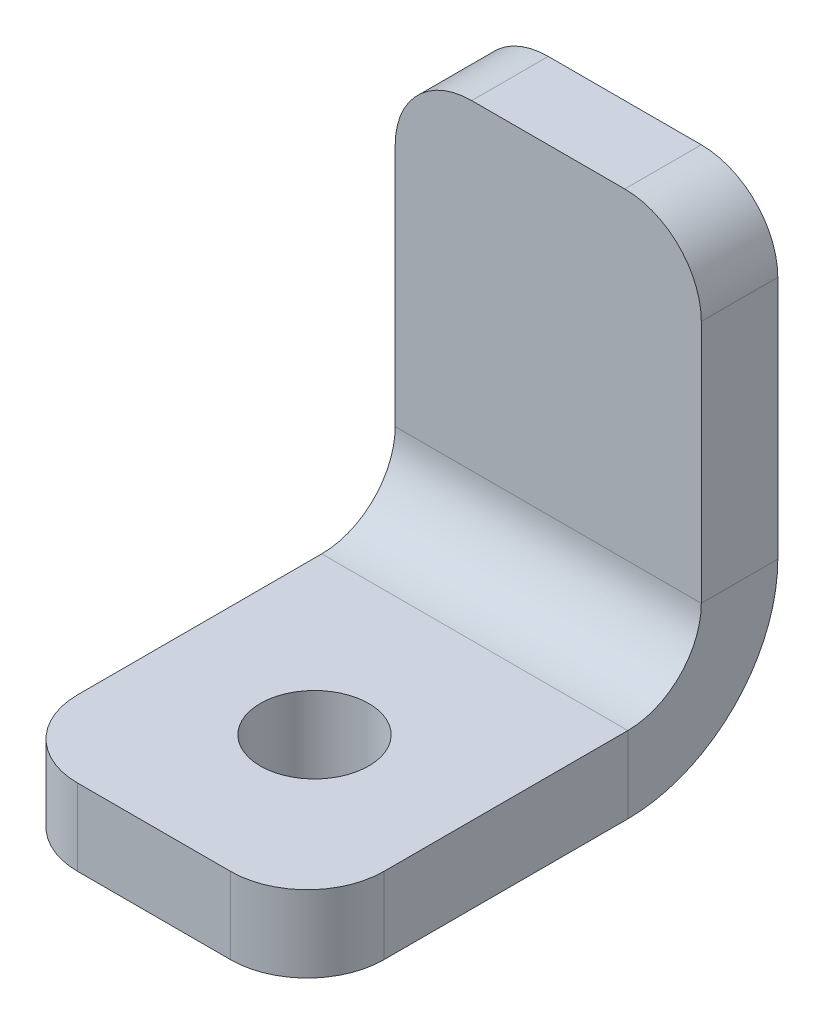
ISO-10303-21;
HEADER;
FILE_DESCRIPTION(('STEP AP214'),'2;1');
FILE_NAME('part.step','',(''),(''),'','','');
FILE_SCHEMA(('AUTOMOTIVE_DESIGN { 1 0 10303 214 1 1 1 1 }'));
ENDSEC;
DATA;
#1=APPLICATION_CONTEXT('core data for automotive mechanical design processes');
#2=APPLICATION_PROTOCOL_DEFINITION('international standard','automotive_design',2000,#1);
#3=PRODUCT_CONTEXT('',#1,'mechanical');
#4=PRODUCT('Part','Part','',(#3));
#5=PRODUCT_RELATED_PRODUCT_CATEGORY('part','',(#4));
#6=PRODUCT_DEFINITION_FORMATION('','',#4);
#7=PRODUCT_DEFINITION_CONTEXT('part definition',#1,'design');
#8=PRODUCT_DEFINITION('design','',#6,#7);
#9=PRODUCT_DEFINITION_SHAPE('','',#8);
#10=(LENGTH_UNIT() NAMED_UNIT(*) SI_UNIT(.MILLI.,.METRE.));
#11=(NAMED_UNIT(*) PLANE_ANGLE_UNIT() SI_UNIT($,.RADIAN.));
#12=(NAMED_UNIT(*) SI_UNIT($,.STERADIAN.) SOLID_ANGLE_UNIT());
#13=UNCERTAINTY_MEASURE_WITH_UNIT(LENGTH_MEASURE(1.E-05),#10,'distance_accuracy_value','');
#14=(GEOMETRIC_REPRESENTATION_CONTEXT(3) GLOBAL_UNCERTAINTY_ASSIGNED_CONTEXT((#13)) GLOBAL_UNIT_ASSIGNED_CONTEXT((#10,
#11,#12)) REPRESENTATION_CONTEXT('',''));
#15=CARTESIAN_POINT('',(0.,0.,0.));
#16=DIRECTION('',(0.,0.,1.));
#17=DIRECTION('',(1.,0.,0.));
#18=AXIS2_PLACEMENT_3D('',#15,#16,#17);
#19=CARTESIAN_POINT('',(12.7,0.,3.));
#20=DIRECTION('',(-1.,0.,0.));
#21=DIRECTION('',(0.,1.,0.));
#22=AXIS2_PLACEMENT_3D('',#19,#20,#21);
#23=PLANE('',#22);
#24=DIRECTION('',(0.,1.,0.));
#25=VECTOR('',#24,1.);
#26=CARTESIAN_POINT('',(12.7,0.,-0.175));
#27=LINE('',#26,#25);
#28=CARTESIAN_POINT('',(12.7,6.22299999999999,-0.175));
#29=VERTEX_POINT('',#28);
#30=CARTESIAN_POINT('',(12.7,16.350000066,-0.175));
#31=VERTEX_POINT('',#30);
#32=EDGE_CURVE('E232',#29,#31,#27,.T.);
#33=ORIENTED_EDGE('',*,*,#32,.T.);
#34=DIRECTION('',(0.,0.,-1.));
#35=VECTOR('',#34,1.);
#36=CARTESIAN_POINT('',(12.7,16.350000066,3.));
#37=LINE('',#36,#35);
#38=CARTESIAN_POINT('',(12.7,16.350000066,3.));
#39=VERTEX_POINT('',#38);
#40=EDGE_CURVE('E13',#31,#39,#37,.F.);
#41=ORIENTED_EDGE('',*,*,#40,.T.);
#42=DIRECTION('',(0.,1.,0.));
#43=VECTOR('',#42,1.);
#44=CARTESIAN_POINT('',(12.7,0.,3.));
#45=LINE('',#44,#43);
#46=CARTESIAN_POINT('',(12.7,6.22299999999999,3.));
#47=VERTEX_POINT('',#46);
#48=EDGE_CURVE('E223',#47,#39,#45,.T.);
#49=ORIENTED_EDGE('',*,*,#48,.F.);
#50=DIRECTION('',(0.,0.,-1.));
#51=VECTOR('',#50,1.);
#52=CARTESIAN_POINT('',(12.7,6.22299999999999,3.));
#53=LINE('',#52,#51);
#54=EDGE_CURVE('E208',#47,#29,#53,.T.);
#55=ORIENTED_EDGE('',*,*,#54,.T.);
#56=EDGE_LOOP('',(#33,#41,#49,#55));
#57=FACE_BOUND('',#56,.T.);
#58=ADVANCED_FACE('F60',(#57),#23,.F.);
#59=CARTESIAN_POINT('',(0.,0.,3.));
#60=DIRECTION('',(0.,0.,-1.));
#61=DIRECTION('',(-1.,0.,0.));
#62=AXIS2_PLACEMENT_3D('',#59,#60,#61);
#63=PLANE('',#62);
#64=DIRECTION('',(-1.,0.,0.));
#65=VECTOR('',#64,1.);
#66=CARTESIAN_POINT('',(0.,19.525000066,3.));
#67=LINE('',#66,#65);
#68=CARTESIAN_POINT('',(9.525,19.525000066,3.));
#69=VERTEX_POINT('',#68);
#70=CARTESIAN_POINT('',(3.175,19.525000066,3.));
#71=VERTEX_POINT('',#70);
#72=EDGE_CURVE('E227',#69,#71,#67,.T.);
#73=ORIENTED_EDGE('',*,*,#72,.T.);
#74=CARTESIAN_POINT('',(3.175,16.350000066,3.));
#75=DIRECTION('',(0.,0.,-1.));
#76=DIRECTION('',(-1.,0.,0.));
#77=AXIS2_PLACEMENT_3D('',#74,#75,#76);
#78=CIRCLE('',#77,3.175);
#79=CARTESIAN_POINT('',(0.,16.350000066,3.));
#80=VERTEX_POINT('',#79);
#81=EDGE_CURVE('E259',#71,#80,#78,.F.);
#82=ORIENTED_EDGE('',*,*,#81,.T.);
#83=DIRECTION('',(0.,-1.,0.));
#84=VECTOR('',#83,1.);
#85=CARTESIAN_POINT('',(0.,0.,3.));
#86=LINE('',#85,#84);
#87=CARTESIAN_POINT('',(0.,6.22299999999999,3.));
#88=VERTEX_POINT('',#87);
#89=EDGE_CURVE('E221',#80,#88,#86,.T.);
#90=ORIENTED_EDGE('',*,*,#89,.T.);
#91=DIRECTION('',(1.,0.,0.));
#92=VECTOR('',#91,1.);
#93=CARTESIAN_POINT('',(12.7,6.22299999999999,3.));
#94=LINE('',#93,#92);
#95=EDGE_CURVE('E212',#47,#88,#94,.F.);
#96=ORIENTED_EDGE('',*,*,#95,.F.);
#97=ORIENTED_EDGE('',*,*,#48,.T.);
#98=CARTESIAN_POINT('',(9.525,16.350000066,3.));
#99=DIRECTION('',(0.,0.,-1.));
#100=DIRECTION('',(-1.,0.,0.));
#101=AXIS2_PLACEMENT_3D('',#98,#99,#100);
#102=CIRCLE('',#101,3.175);
#103=EDGE_CURVE('E257',#39,#69,#102,.F.);
#104=ORIENTED_EDGE('',*,*,#103,.T.);
#105=EDGE_LOOP('',(#73,#82,#90,#96,#97,#104));
#106=FACE_BOUND('',#105,.T.);
#107=ADVANCED_FACE('F272',(#106),#63,.F.);
#108=CARTESIAN_POINT('',(0.,0.,-0.175));
#109=DIRECTION('',(0.,0.,-1.));
#110=DIRECTION('',(-1.,0.,0.));
#111=AXIS2_PLACEMENT_3D('',#108,#109,#110);
#112=PLANE('',#111);
#113=DIRECTION('',(0.,1.,0.));
#114=VECTOR('',#113,1.);
#115=CARTESIAN_POINT('',(0.,0.,-0.175));
#116=LINE('',#115,#114);
#117=CARTESIAN_POINT('',(0.,16.350000066,-0.175));
#118=VERTEX_POINT('',#117);
#119=CARTESIAN_POINT('',(0.,6.22300000000001,-0.175));
#120=VERTEX_POINT('',#119);
#121=EDGE_CURVE('E219',#118,#120,#116,.F.);
#122=ORIENTED_EDGE('',*,*,#121,.F.);
#123=CARTESIAN_POINT('',(3.175,16.350000066,-0.175));
#124=DIRECTION('',(0.,0.,-1.));
#125=DIRECTION('',(-1.,0.,0.));
#126=AXIS2_PLACEMENT_3D('',#123,#124,#125);
#127=CIRCLE('',#126,3.175);
#128=CARTESIAN_POINT('',(3.175,19.525000066,-0.175));
#129=VERTEX_POINT('',#128);
#130=EDGE_CURVE('E68',#118,#129,#127,.T.);
#131=ORIENTED_EDGE('',*,*,#130,.T.);
#132=DIRECTION('',(-1.,0.,0.));
#133=VECTOR('',#132,1.);
#134=CARTESIAN_POINT('',(0.,19.525000066,-0.175));
#135=LINE('',#134,#133);
#136=CARTESIAN_POINT('',(9.525,19.525000066,-0.175));
#137=VERTEX_POINT('',#136);
#138=EDGE_CURVE('E224',#137,#129,#135,.T.);
#139=ORIENTED_EDGE('',*,*,#138,.F.);
#140=CARTESIAN_POINT('',(9.525,16.350000066,-0.175));
#141=DIRECTION('',(0.,0.,-1.));
#142=DIRECTION('',(-1.,0.,0.));
#143=AXIS2_PLACEMENT_3D('',#140,#141,#142);
#144=CIRCLE('',#143,3.175);
#145=EDGE_CURVE('E75',#137,#31,#144,.T.);
#146=ORIENTED_EDGE('',*,*,#145,.T.);
#147=ORIENTED_EDGE('',*,*,#32,.F.);
#148=DIRECTION('',(1.,0.,0.));
#149=VECTOR('',#148,1.);
#150=CARTESIAN_POINT('',(12.7,6.22299999999999,-0.175));
#151=LINE('',#150,#149);
#152=EDGE_CURVE('E160',#29,#120,#151,.F.);
#153=ORIENTED_EDGE('',*,*,#152,.T.);
#154=EDGE_LOOP('',(#122,#131,#139,#146,#147,#153));
#155=FACE_BOUND('',#154,.T.);
#156=ADVANCED_FACE('F263',(#155),#112,.T.);
#157=CARTESIAN_POINT('',(0.,19.525000066,3.));
#158=DIRECTION('',(0.,-1.,0.));
#159=DIRECTION('',(-1.,0.,0.));
#160=AXIS2_PLACEMENT_3D('',#157,#158,#159);
#161=PLANE('',#160);
#162=ORIENTED_EDGE('',*,*,#138,.T.);
#163=DIRECTION('',(0.,0.,-1.));
#164=VECTOR('',#163,1.);
#165=CARTESIAN_POINT('',(3.175,19.525000066,3.));
#166=LINE('',#165,#164);
#167=EDGE_CURVE('E254',#129,#71,#166,.F.);
#168=ORIENTED_EDGE('',*,*,#167,.T.);
#169=ORIENTED_EDGE('',*,*,#72,.F.);
#170=DIRECTION('',(0.,0.,-1.));
#171=VECTOR('',#170,1.);
#172=CARTESIAN_POINT('',(9.525,19.525000066,3.));
#173=LINE('',#172,#171);
#174=EDGE_CURVE('E252',#69,#137,#173,.T.);
#175=ORIENTED_EDGE('',*,*,#174,.T.);
#176=EDGE_LOOP('',(#162,#168,#169,#175));
#177=FACE_BOUND('',#176,.T.);
#178=ADVANCED_FACE('F267',(#177),#161,.F.);
#179=CARTESIAN_POINT('',(0.,0.,3.));
#180=DIRECTION('',(1.,0.,0.));
#181=DIRECTION('',(0.,-1.,0.));
#182=AXIS2_PLACEMENT_3D('',#179,#180,#181);
#183=PLANE('',#182);
#184=ORIENTED_EDGE('',*,*,#89,.F.);
#185=DIRECTION('',(0.,0.,-1.));
#186=VECTOR('',#185,1.);
#187=CARTESIAN_POINT('',(0.,16.350000066,3.));
#188=LINE('',#187,#186);
#189=EDGE_CURVE('E83',#80,#118,#188,.T.);
#190=ORIENTED_EDGE('',*,*,#189,.T.);
#191=ORIENTED_EDGE('',*,*,#121,.T.);
#192=DIRECTION('',(0.,0.,-1.));
#193=VECTOR('',#192,1.);
#194=CARTESIAN_POINT('',(0.,6.22299999999999,3.));
#195=LINE('',#194,#193);
#196=EDGE_CURVE('E216',#88,#120,#195,.T.);
#197=ORIENTED_EDGE('',*,*,#196,.F.);
#198=EDGE_LOOP('',(#184,#190,#191,#197));
#199=FACE_BOUND('',#198,.T.);
#200=ADVANCED_FACE('F275',(#199),#183,.F.);
#201=CARTESIAN_POINT('',(0.,6.22299999999999,6.048));
#202=DIRECTION('',(-1.,0.,0.));
#203=DIRECTION('',(0.,0.,1.));
#204=AXIS2_PLACEMENT_3D('',#201,#202,#203);
#205=PLANE('',#204);
#206=DIRECTION('',(0.,1.,0.));
#207=VECTOR('',#206,1.);
#208=CARTESIAN_POINT('',(0.,0.,6.04799999999998));
#209=LINE('',#208,#207);
#210=CARTESIAN_POINT('',(0.,3.17499999999999,6.04799999999999));
#211=VERTEX_POINT('',#210);
#212=CARTESIAN_POINT('',(0.,0.,6.04799999999998));
#213=VERTEX_POINT('',#212);
#214=EDGE_CURVE('E202',#211,#213,#209,.F.);
#215=ORIENTED_EDGE('',*,*,#214,.F.);
#216=CARTESIAN_POINT('',(0.,6.22299999999999,6.048));
#217=DIRECTION('',(1.,0.,0.));
#218=DIRECTION('',(0.,0.,-1.));
#219=AXIS2_PLACEMENT_3D('',#216,#217,#218);
#220=CIRCLE('',#219,3.048);
#221=EDGE_CURVE('E163',#88,#211,#220,.F.);
#222=ORIENTED_EDGE('',*,*,#221,.F.);
#223=ORIENTED_EDGE('',*,*,#196,.T.);
#224=CARTESIAN_POINT('',(0.,6.22299999999999,6.048));
#225=DIRECTION('',(1.,0.,0.));
#226=DIRECTION('',(0.,0.,-1.));
#227=AXIS2_PLACEMENT_3D('',#224,#225,#226);
#228=CIRCLE('',#227,6.223);
#229=EDGE_CURVE('E207',#120,#213,#228,.F.);
#230=ORIENTED_EDGE('',*,*,#229,.T.);
#231=EDGE_LOOP('',(#215,#222,#223,#230));
#232=FACE_BOUND('',#231,.T.);
#233=ADVANCED_FACE('F279',(#232),#205,.T.);
#234=CARTESIAN_POINT('',(12.7,6.22299999999999,6.048));
#235=DIRECTION('',(-1.,0.,0.));
#236=DIRECTION('',(0.,0.,1.));
#237=AXIS2_PLACEMENT_3D('',#234,#235,#236);
#238=PLANE('',#237);
#239=CARTESIAN_POINT('',(12.7,6.22299999999999,6.048));
#240=DIRECTION('',(1.,0.,0.));
#241=DIRECTION('',(0.,0.,-1.));
#242=AXIS2_PLACEMENT_3D('',#239,#240,#241);
#243=CIRCLE('',#242,3.048);
#244=CARTESIAN_POINT('',(12.7,3.17499999999999,6.04799999999999));
#245=VERTEX_POINT('',#244);
#246=EDGE_CURVE('E170',#245,#47,#243,.T.);
#247=ORIENTED_EDGE('',*,*,#246,.F.);
#248=DIRECTION('',(0.,1.,0.));
#249=VECTOR('',#248,1.);
#250=CARTESIAN_POINT('',(12.7,3.17499999999999,6.04799999999999));
#251=LINE('',#250,#249);
#252=CARTESIAN_POINT('',(12.7,0.,6.04799999999998));
#253=VERTEX_POINT('',#252);
#254=EDGE_CURVE('E167',#245,#253,#251,.F.);
#255=ORIENTED_EDGE('',*,*,#254,.T.);
#256=CARTESIAN_POINT('',(12.7,6.22299999999999,6.048));
#257=DIRECTION('',(1.,0.,0.));
#258=DIRECTION('',(0.,0.,-1.));
#259=AXIS2_PLACEMENT_3D('',#256,#257,#258);
#260=CIRCLE('',#259,6.223);
#261=EDGE_CURVE('E152',#253,#29,#260,.T.);
#262=ORIENTED_EDGE('',*,*,#261,.T.);
#263=ORIENTED_EDGE('',*,*,#54,.F.);
#264=EDGE_LOOP('',(#247,#255,#262,#263));
#265=FACE_BOUND('',#264,.T.);
#266=ADVANCED_FACE('F168',(#265),#238,.F.);
#267=CARTESIAN_POINT('',(12.7,6.22299999999999,6.048));
#268=DIRECTION('',(1.,0.,0.));
#269=DIRECTION('',(0.,-1.,0.));
#270=AXIS2_PLACEMENT_3D('',#267,#268,#269);
#271=CYLINDRICAL_SURFACE('',#270,6.223);
#272=ORIENTED_EDGE('',*,*,#152,.F.);
#273=ORIENTED_EDGE('',*,*,#261,.F.);
#274=DIRECTION('',(1.,0.,0.));
#275=VECTOR('',#274,1.);
#276=CARTESIAN_POINT('',(0.,0.,6.04799999999998));
#277=LINE('',#276,#275);
#278=EDGE_CURVE('E157',#253,#213,#277,.F.);
#279=ORIENTED_EDGE('',*,*,#278,.T.);
#280=ORIENTED_EDGE('',*,*,#229,.F.);
#281=EDGE_LOOP('',(#272,#273,#279,#280));
#282=FACE_BOUND('',#281,.T.);
#283=ADVANCED_FACE('F154',(#282),#271,.T.);
#284=CARTESIAN_POINT('',(12.7,6.22299999999999,6.048));
#285=DIRECTION('',(1.,0.,0.));
#286=DIRECTION('',(0.,-1.,0.));
#287=AXIS2_PLACEMENT_3D('',#284,#285,#286);
#288=CYLINDRICAL_SURFACE('',#287,3.048);
#289=ORIENTED_EDGE('',*,*,#95,.T.);
#290=ORIENTED_EDGE('',*,*,#221,.T.);
#291=DIRECTION('',(1.,0.,0.));
#292=VECTOR('',#291,1.);
#293=CARTESIAN_POINT('',(0.,3.17499999999999,6.04799999999999));
#294=LINE('',#293,#292);
#295=EDGE_CURVE('E175',#211,#245,#294,.T.);
#296=ORIENTED_EDGE('',*,*,#295,.T.);
#297=ORIENTED_EDGE('',*,*,#246,.T.);
#298=EDGE_LOOP('',(#289,#290,#296,#297));
#299=FACE_BOUND('',#298,.T.);
#300=ADVANCED_FACE('F285',(#299),#288,.F.);
#301=CARTESIAN_POINT('',(12.7,0.,19.350000066));
#302=DIRECTION('',(-1.,0.,0.));
#303=DIRECTION('',(0.,0.,1.));
#304=AXIS2_PLACEMENT_3D('',#301,#302,#303);
#305=PLANE('',#304);
#306=DIRECTION('',(0.,0.,-1.));
#307=VECTOR('',#306,1.);
#308=CARTESIAN_POINT('',(12.7,3.17499999999994,19.350000066));
#309=LINE('',#308,#307);
#310=CARTESIAN_POINT('',(12.7,3.17499999999995,16.175000066));
#311=VERTEX_POINT('',#310);
#312=EDGE_CURVE('E184',#245,#311,#309,.F.);
#313=ORIENTED_EDGE('',*,*,#312,.T.);
#314=DIRECTION('',(0.,1.,0.));
#315=VECTOR('',#314,1.);
#316=CARTESIAN_POINT('',(12.7,0.,16.175000066));
#317=LINE('',#316,#315);
#318=CARTESIAN_POINT('',(12.7,0.,16.175000066));
#319=VERTEX_POINT('',#318);
#320=EDGE_CURVE('E188',#311,#319,#317,.F.);
#321=ORIENTED_EDGE('',*,*,#320,.T.);
#322=DIRECTION('',(0.,0.,1.));
#323=VECTOR('',#322,1.);
#324=CARTESIAN_POINT('',(12.7,0.,0.));
#325=LINE('',#324,#323);
#326=EDGE_CURVE('E180',#253,#319,#325,.T.);
#327=ORIENTED_EDGE('',*,*,#326,.F.);
#328=ORIENTED_EDGE('',*,*,#254,.F.);
#329=EDGE_LOOP('',(#313,#321,#327,#328));
#330=FACE_BOUND('',#329,.T.);
#331=ADVANCED_FACE('F186',(#330),#305,.F.);
#332=CARTESIAN_POINT('',(0.,0.,2.99999999999999));
#333=DIRECTION('',(1.,0.,0.));
#334=DIRECTION('',(0.,0.,-1.));
#335=AXIS2_PLACEMENT_3D('',#332,#333,#334);
#336=PLANE('',#335);
#337=DIRECTION('',(0.,0.,-1.));
#338=VECTOR('',#337,1.);
#339=CARTESIAN_POINT('',(0.,0.,0.));
#340=LINE('',#339,#338);
#341=CARTESIAN_POINT('',(0.,0.,16.175000066));
#342=VERTEX_POINT('',#341);
#343=EDGE_CURVE('E183',#342,#213,#340,.T.);
#344=ORIENTED_EDGE('',*,*,#343,.F.);
#345=DIRECTION('',(0.,1.,0.));
#346=VECTOR('',#345,1.);
#347=CARTESIAN_POINT('',(0.,0.,16.175000066));
#348=LINE('',#347,#346);
#349=CARTESIAN_POINT('',(0.,3.17499999999995,16.175000066));
#350=VERTEX_POINT('',#349);
#351=EDGE_CURVE('E249',#342,#350,#348,.T.);
#352=ORIENTED_EDGE('',*,*,#351,.T.);
#353=DIRECTION('',(0.,0.,1.));
#354=VECTOR('',#353,1.);
#355=CARTESIAN_POINT('',(0.,3.175,3.));
#356=LINE('',#355,#354);
#357=EDGE_CURVE('E190',#350,#211,#356,.F.);
#358=ORIENTED_EDGE('',*,*,#357,.T.);
#359=ORIENTED_EDGE('',*,*,#214,.T.);
#360=EDGE_LOOP('',(#344,#352,#358,#359));
#361=FACE_BOUND('',#360,.T.);
#362=ADVANCED_FACE('F303',(#361),#336,.F.);
#363=CARTESIAN_POINT('',(0.,0.,0.));
#364=DIRECTION('',(0.,1.,0.));
#365=DIRECTION('',(0.,0.,1.));
#366=AXIS2_PLACEMENT_3D('',#363,#364,#365);
#367=PLANE('',#366);
#368=CARTESIAN_POINT('',(6.35,0.,12.699000033));
#369=DIRECTION('',(0.,1.,0.));
#370=DIRECTION('',(0.,0.,1.));
#371=AXIS2_PLACEMENT_3D('',#368,#369,#370);
#372=CIRCLE('',#371,2.25);
#373=CARTESIAN_POINT('',(6.35,0.,14.949000033));
#374=VERTEX_POINT('',#373);
#375=EDGE_CURVE('E205',#374,#374,#372,.T.);
#376=ORIENTED_EDGE('',*,*,#375,.T.);
#377=EDGE_LOOP('',(#376));
#378=FACE_BOUND('',#377,.T.);
#379=ORIENTED_EDGE('',*,*,#326,.T.);
#380=CARTESIAN_POINT('',(9.525,0.,16.175000066));
#381=DIRECTION('',(0.,1.,0.));
#382=DIRECTION('',(0.,0.,1.));
#383=AXIS2_PLACEMENT_3D('',#380,#381,#382);
#384=CIRCLE('',#383,3.175);
#385=CARTESIAN_POINT('',(9.525,0.,19.350000066));
#386=VERTEX_POINT('',#385);
#387=EDGE_CURVE('E247',#319,#386,#384,.F.);
#388=ORIENTED_EDGE('',*,*,#387,.T.);
#389=DIRECTION('',(-1.,0.,0.));
#390=VECTOR('',#389,1.);
#391=CARTESIAN_POINT('',(0.,0.,19.350000066));
#392=LINE('',#391,#390);
#393=CARTESIAN_POINT('',(3.175,0.,19.350000066));
#394=VERTEX_POINT('',#393);
#395=EDGE_CURVE('E189',#386,#394,#392,.T.);
#396=ORIENTED_EDGE('',*,*,#395,.T.);
#397=CARTESIAN_POINT('',(3.175,0.,16.175000066));
#398=DIRECTION('',(0.,1.,0.));
#399=DIRECTION('',(0.,0.,1.));
#400=AXIS2_PLACEMENT_3D('',#397,#398,#399);
#401=CIRCLE('',#400,3.175);
#402=EDGE_CURVE('E245',#394,#342,#401,.F.);
#403=ORIENTED_EDGE('',*,*,#402,.T.);
#404=ORIENTED_EDGE('',*,*,#343,.T.);
#405=ORIENTED_EDGE('',*,*,#278,.F.);
#406=EDGE_LOOP('',(#379,#388,#396,#403,#404,#405));
#407=FACE_BOUND('',#406,.T.);
#408=ADVANCED_FACE('F179',(#378,#407),#367,.F.);
#409=CARTESIAN_POINT('',(0.,3.17500000000001,0.));
#410=DIRECTION('',(0.,1.,0.));
#411=DIRECTION('',(0.,0.,1.));
#412=AXIS2_PLACEMENT_3D('',#409,#410,#411);
#413=PLANE('',#412);
#414=CARTESIAN_POINT('',(6.35,3.17499999999997,12.699000033));
#415=DIRECTION('',(0.,1.,0.));
#416=DIRECTION('',(0.,0.,1.));
#417=AXIS2_PLACEMENT_3D('',#414,#415,#416);
#418=CIRCLE('',#417,2.25);
#419=CARTESIAN_POINT('',(6.35,3.17499999999996,14.949000033));
#420=VERTEX_POINT('',#419);
#421=EDGE_CURVE('E307',#420,#420,#418,.T.);
#422=ORIENTED_EDGE('',*,*,#421,.F.);
#423=EDGE_LOOP('',(#422));
#424=FACE_BOUND('',#423,.T.);
#425=DIRECTION('',(1.,0.,0.));
#426=VECTOR('',#425,1.);
#427=CARTESIAN_POINT('',(0.,3.17499999999994,19.350000066));
#428=LINE('',#427,#426);
#429=CARTESIAN_POINT('',(9.525,3.17499999999994,19.350000066));
#430=VERTEX_POINT('',#429);
#431=CARTESIAN_POINT('',(3.175,3.17499999999994,19.350000066));
#432=VERTEX_POINT('',#431);
#433=EDGE_CURVE('E194',#430,#432,#428,.F.);
#434=ORIENTED_EDGE('',*,*,#433,.F.);
#435=CARTESIAN_POINT('',(9.525,3.17499999999995,16.175000066));
#436=DIRECTION('',(0.,1.,0.));
#437=DIRECTION('',(0.,0.,1.));
#438=AXIS2_PLACEMENT_3D('',#435,#436,#437);
#439=CIRCLE('',#438,3.175);
#440=EDGE_CURVE('E242',#430,#311,#439,.T.);
#441=ORIENTED_EDGE('',*,*,#440,.T.);
#442=ORIENTED_EDGE('',*,*,#312,.F.);
#443=ORIENTED_EDGE('',*,*,#295,.F.);
#444=ORIENTED_EDGE('',*,*,#357,.F.);
#445=CARTESIAN_POINT('',(3.175,3.17499999999995,16.175000066));
#446=DIRECTION('',(0.,1.,0.));
#447=DIRECTION('',(0.,0.,1.));
#448=AXIS2_PLACEMENT_3D('',#445,#446,#447);
#449=CIRCLE('',#448,3.175);
#450=EDGE_CURVE('E240',#350,#432,#449,.T.);
#451=ORIENTED_EDGE('',*,*,#450,.T.);
#452=EDGE_LOOP('',(#434,#441,#442,#443,#444,#451));
#453=FACE_BOUND('',#452,.T.);
#454=ADVANCED_FACE('F290',(#424,#453),#413,.T.);
#455=CARTESIAN_POINT('',(0.,0.,19.350000066));
#456=DIRECTION('',(0.,0.,-1.));
#457=DIRECTION('',(0.,1.,0.));
#458=AXIS2_PLACEMENT_3D('',#455,#456,#457);
#459=PLANE('',#458);
#460=ORIENTED_EDGE('',*,*,#395,.F.);
#461=DIRECTION('',(0.,1.,0.));
#462=VECTOR('',#461,1.);
#463=CARTESIAN_POINT('',(9.525,0.,19.350000066));
#464=LINE('',#463,#462);
#465=EDGE_CURVE('E237',#386,#430,#464,.T.);
#466=ORIENTED_EDGE('',*,*,#465,.T.);
#467=ORIENTED_EDGE('',*,*,#433,.T.);
#468=DIRECTION('',(0.,1.,0.));
#469=VECTOR('',#468,1.);
#470=CARTESIAN_POINT('',(3.175,0.,19.350000066));
#471=LINE('',#470,#469);
#472=EDGE_CURVE('E230',#432,#394,#471,.F.);
#473=ORIENTED_EDGE('',*,*,#472,.T.);
#474=EDGE_LOOP('',(#460,#466,#467,#473));
#475=FACE_BOUND('',#474,.T.);
#476=ADVANCED_FACE('F297',(#475),#459,.F.);
#477=CARTESIAN_POINT('',(6.35,3.17499999999997,12.699000033));
#478=DIRECTION('',(0.,1.,0.));
#479=DIRECTION('',(0.,0.,1.));
#480=AXIS2_PLACEMENT_3D('',#477,#478,#479);
#481=CYLINDRICAL_SURFACE('',#480,2.25);
#482=ORIENTED_EDGE('',*,*,#421,.T.);
#483=EDGE_LOOP('',(#482));
#484=FACE_BOUND('',#483,.T.);
#485=ORIENTED_EDGE('',*,*,#375,.F.);
#486=EDGE_LOOP('',(#485));
#487=FACE_BOUND('',#486,.T.);
#488=ADVANCED_FACE('F311',(#484,#487),#481,.F.);
#489=CARTESIAN_POINT('',(9.525,0.,16.175000066));
#490=DIRECTION('',(0.,1.,0.));
#491=DIRECTION('',(0.,0.,1.));
#492=AXIS2_PLACEMENT_3D('',#489,#490,#491);
#493=CYLINDRICAL_SURFACE('',#492,3.175);
#494=ORIENTED_EDGE('',*,*,#387,.F.);
#495=ORIENTED_EDGE('',*,*,#320,.F.);
#496=ORIENTED_EDGE('',*,*,#440,.F.);
#497=ORIENTED_EDGE('',*,*,#465,.F.);
#498=EDGE_LOOP('',(#494,#495,#496,#497));
#499=FACE_BOUND('',#498,.T.);
#500=ADVANCED_FACE('F292',(#499),#493,.T.);
#501=CARTESIAN_POINT('',(3.175,0.,16.175000066));
#502=DIRECTION('',(0.,1.,0.));
#503=DIRECTION('',(0.,0.,1.));
#504=AXIS2_PLACEMENT_3D('',#501,#502,#503);
#505=CYLINDRICAL_SURFACE('',#504,3.175);
#506=ORIENTED_EDGE('',*,*,#402,.F.);
#507=ORIENTED_EDGE('',*,*,#472,.F.);
#508=ORIENTED_EDGE('',*,*,#450,.F.);
#509=ORIENTED_EDGE('',*,*,#351,.F.);
#510=EDGE_LOOP('',(#506,#507,#508,#509));
#511=FACE_BOUND('',#510,.T.);
#512=ADVANCED_FACE('F300',(#511),#505,.T.);
#513=CARTESIAN_POINT('',(3.175,16.350000066,3.));
#514=DIRECTION('',(0.,0.,1.));
#515=DIRECTION('',(1.,0.,0.));
#516=AXIS2_PLACEMENT_3D('',#513,#514,#515);
#517=CYLINDRICAL_SURFACE('',#516,3.175);
#518=ORIENTED_EDGE('',*,*,#130,.F.);
#519=ORIENTED_EDGE('',*,*,#189,.F.);
#520=ORIENTED_EDGE('',*,*,#81,.F.);
#521=ORIENTED_EDGE('',*,*,#167,.F.);
#522=EDGE_LOOP('',(#518,#519,#520,#521));
#523=FACE_BOUND('',#522,.T.);
#524=ADVANCED_FACE('F270',(#523),#517,.T.);
#525=CARTESIAN_POINT('',(9.525,16.350000066,3.));
#526=DIRECTION('',(0.,0.,1.));
#527=DIRECTION('',(1.,0.,0.));
#528=AXIS2_PLACEMENT_3D('',#525,#526,#527);
#529=CYLINDRICAL_SURFACE('',#528,3.175);
#530=ORIENTED_EDGE('',*,*,#145,.F.);
#531=ORIENTED_EDGE('',*,*,#174,.F.);
#532=ORIENTED_EDGE('',*,*,#103,.F.);
#533=ORIENTED_EDGE('',*,*,#40,.F.);
#534=EDGE_LOOP('',(#530,#531,#532,#533));
#535=FACE_BOUND('',#534,.T.);
#536=ADVANCED_FACE('F62',(#535),#529,.T.);
#537=CLOSED_SHELL('',(#58,#107,#156,#178,#200,#233,#266,#283,#300,#331,#362,#408,#454,#476,#488,
#500,#512,#524,#536));
#538=MANIFOLD_SOLID_BREP('B2',#537);
#539=ADVANCED_BREP_SHAPE_REPRESENTATION('',(#18,#538),#14);
#540=SHAPE_DEFINITION_REPRESENTATION(#9,#539);
ENDSEC;
END-ISO-10303-21;
